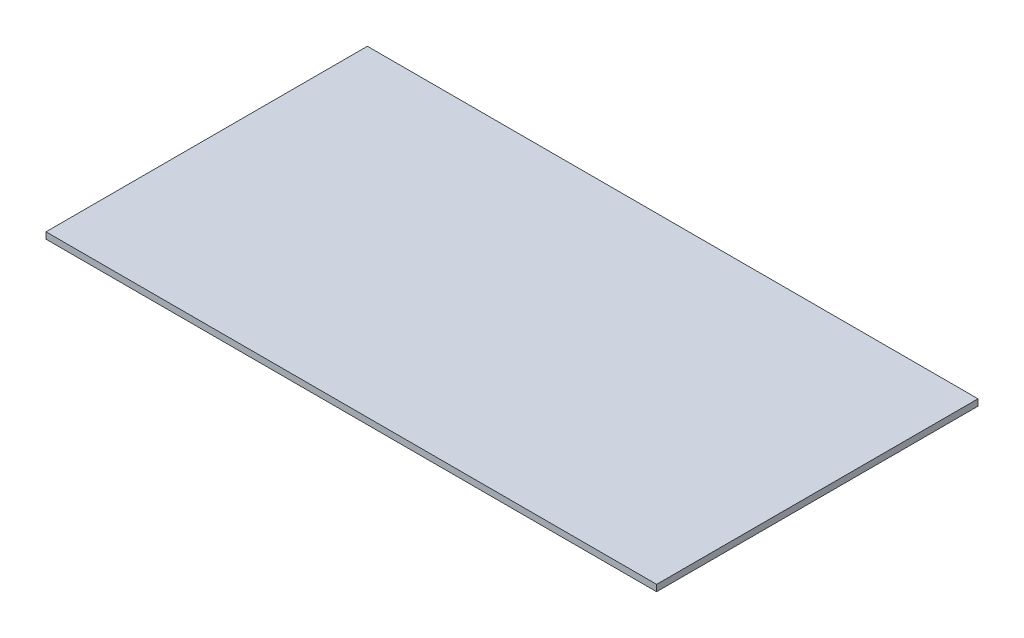
ISO-10303-21;
HEADER;
FILE_DESCRIPTION(('STEP AP214'),'2;1');
FILE_NAME('part.step','',(''),(''),'','','');
FILE_SCHEMA(('AUTOMOTIVE_DESIGN { 1 0 10303 214 1 1 1 1 }'));
ENDSEC;
DATA;
#1=APPLICATION_CONTEXT('core data for automotive mechanical design processes');
#2=APPLICATION_PROTOCOL_DEFINITION('international standard','automotive_design',2000,#1);
#3=PRODUCT_CONTEXT('',#1,'mechanical');
#4=PRODUCT('Part','Part','',(#3));
#5=PRODUCT_RELATED_PRODUCT_CATEGORY('part','',(#4));
#6=PRODUCT_DEFINITION_FORMATION('','',#4);
#7=PRODUCT_DEFINITION_CONTEXT('part definition',#1,'design');
#8=PRODUCT_DEFINITION('design','',#6,#7);
#9=PRODUCT_DEFINITION_SHAPE('','',#8);
#10=(LENGTH_UNIT() NAMED_UNIT(*) SI_UNIT(.MILLI.,.METRE.));
#11=(NAMED_UNIT(*) PLANE_ANGLE_UNIT() SI_UNIT($,.RADIAN.));
#12=(NAMED_UNIT(*) SI_UNIT($,.STERADIAN.) SOLID_ANGLE_UNIT());
#13=UNCERTAINTY_MEASURE_WITH_UNIT(LENGTH_MEASURE(1.E-05),#10,'distance_accuracy_value','');
#14=(GEOMETRIC_REPRESENTATION_CONTEXT(3) GLOBAL_UNCERTAINTY_ASSIGNED_CONTEXT((#13)) GLOBAL_UNIT_ASSIGNED_CONTEXT((#10,
#11,#12)) REPRESENTATION_CONTEXT('',''));
#15=CARTESIAN_POINT('',(0.,0.,0.));
#16=DIRECTION('',(0.,0.,1.));
#17=DIRECTION('',(1.,0.,0.));
#18=AXIS2_PLACEMENT_3D('',#15,#16,#17);
#19=CARTESIAN_POINT('',(0.,2.54,0.));
#20=DIRECTION('',(1.,0.,0.));
#21=DIRECTION('',(0.,0.,-1.));
#22=AXIS2_PLACEMENT_3D('',#19,#20,#21);
#23=PLANE('',#22);
#24=DIRECTION('',(0.,0.,1.));
#25=VECTOR('',#24,1.);
#26=CARTESIAN_POINT('',(0.,0.,0.));
#27=LINE('',#26,#25);
#28=CARTESIAN_POINT('',(0.,0.,-127.));
#29=VERTEX_POINT('',#28);
#30=CARTESIAN_POINT('',(0.,0.,0.));
#31=VERTEX_POINT('',#30);
#32=EDGE_CURVE('E96',#29,#31,#27,.T.);
#33=ORIENTED_EDGE('',*,*,#32,.T.);
#34=DIRECTION('',(0.,-1.,0.));
#35=VECTOR('',#34,1.);
#36=CARTESIAN_POINT('',(0.,2.54,0.));
#37=LINE('',#36,#35);
#38=CARTESIAN_POINT('',(0.,2.54,0.));
#39=VERTEX_POINT('',#38);
#40=EDGE_CURVE('E11',#39,#31,#37,.T.);
#41=ORIENTED_EDGE('',*,*,#40,.F.);
#42=DIRECTION('',(0.,0.,1.));
#43=VECTOR('',#42,1.);
#44=CARTESIAN_POINT('',(0.,2.54,0.));
#45=LINE('',#44,#43);
#46=CARTESIAN_POINT('',(0.,2.54,-127.));
#47=VERTEX_POINT('',#46);
#48=EDGE_CURVE('E84',#47,#39,#45,.T.);
#49=ORIENTED_EDGE('',*,*,#48,.F.);
#50=DIRECTION('',(0.,-1.,0.));
#51=VECTOR('',#50,1.);
#52=CARTESIAN_POINT('',(0.,2.54,-127.));
#53=LINE('',#52,#51);
#54=EDGE_CURVE('E92',#47,#29,#53,.T.);
#55=ORIENTED_EDGE('',*,*,#54,.T.);
#56=EDGE_LOOP('',(#33,#41,#49,#55));
#57=FACE_BOUND('',#56,.T.);
#58=ADVANCED_FACE('F33',(#57),#23,.F.);
#59=CARTESIAN_POINT('',(0.,2.54,0.));
#60=DIRECTION('',(0.,0.,-1.));
#61=DIRECTION('',(-1.,0.,0.));
#62=AXIS2_PLACEMENT_3D('',#59,#60,#61);
#63=PLANE('',#62);
#64=DIRECTION('',(1.,0.,0.));
#65=VECTOR('',#64,1.);
#66=CARTESIAN_POINT('',(0.,0.,0.));
#67=LINE('',#66,#65);
#68=CARTESIAN_POINT('',(241.3,0.,0.));
#69=VERTEX_POINT('',#68);
#70=EDGE_CURVE('E88',#31,#69,#67,.T.);
#71=ORIENTED_EDGE('',*,*,#70,.T.);
#72=DIRECTION('',(0.,-1.,0.));
#73=VECTOR('',#72,1.);
#74=CARTESIAN_POINT('',(241.3,2.54,0.));
#75=LINE('',#74,#73);
#76=CARTESIAN_POINT('',(241.3,2.54,0.));
#77=VERTEX_POINT('',#76);
#78=EDGE_CURVE('E41',#77,#69,#75,.T.);
#79=ORIENTED_EDGE('',*,*,#78,.F.);
#80=DIRECTION('',(1.,0.,0.));
#81=VECTOR('',#80,1.);
#82=CARTESIAN_POINT('',(0.,2.54,0.));
#83=LINE('',#82,#81);
#84=EDGE_CURVE('E79',#39,#77,#83,.T.);
#85=ORIENTED_EDGE('',*,*,#84,.F.);
#86=ORIENTED_EDGE('',*,*,#40,.T.);
#87=EDGE_LOOP('',(#71,#79,#85,#86));
#88=FACE_BOUND('',#87,.T.);
#89=ADVANCED_FACE('F87',(#88),#63,.F.);
#90=CARTESIAN_POINT('',(241.3,2.54,0.));
#91=DIRECTION('',(-1.,0.,0.));
#92=DIRECTION('',(0.,0.,1.));
#93=AXIS2_PLACEMENT_3D('',#90,#91,#92);
#94=PLANE('',#93);
#95=DIRECTION('',(0.,0.,-1.));
#96=VECTOR('',#95,1.);
#97=CARTESIAN_POINT('',(241.3,0.,0.));
#98=LINE('',#97,#96);
#99=CARTESIAN_POINT('',(241.3,0.,-127.));
#100=VERTEX_POINT('',#99);
#101=EDGE_CURVE('E66',#69,#100,#98,.T.);
#102=ORIENTED_EDGE('',*,*,#101,.T.);
#103=DIRECTION('',(0.,-1.,0.));
#104=VECTOR('',#103,1.);
#105=CARTESIAN_POINT('',(241.3,2.54,-127.));
#106=LINE('',#105,#104);
#107=CARTESIAN_POINT('',(241.3,2.54,-127.));
#108=VERTEX_POINT('',#107);
#109=EDGE_CURVE('E89',#108,#100,#106,.T.);
#110=ORIENTED_EDGE('',*,*,#109,.F.);
#111=DIRECTION('',(0.,0.,-1.));
#112=VECTOR('',#111,1.);
#113=CARTESIAN_POINT('',(241.3,2.54,0.));
#114=LINE('',#113,#112);
#115=EDGE_CURVE('E82',#77,#108,#114,.T.);
#116=ORIENTED_EDGE('',*,*,#115,.F.);
#117=ORIENTED_EDGE('',*,*,#78,.T.);
#118=EDGE_LOOP('',(#102,#110,#116,#117));
#119=FACE_BOUND('',#118,.T.);
#120=ADVANCED_FACE('F90',(#119),#94,.F.);
#121=CARTESIAN_POINT('',(0.,2.54,-127.));
#122=DIRECTION('',(0.,0.,1.));
#123=DIRECTION('',(1.,0.,0.));
#124=AXIS2_PLACEMENT_3D('',#121,#122,#123);
#125=PLANE('',#124);
#126=DIRECTION('',(-1.,0.,0.));
#127=VECTOR('',#126,1.);
#128=CARTESIAN_POINT('',(0.,0.,-127.));
#129=LINE('',#128,#127);
#130=EDGE_CURVE('E72',#100,#29,#129,.T.);
#131=ORIENTED_EDGE('',*,*,#130,.T.);
#132=ORIENTED_EDGE('',*,*,#54,.F.);
#133=DIRECTION('',(-1.,0.,0.));
#134=VECTOR('',#133,1.);
#135=CARTESIAN_POINT('',(0.,2.54,-127.));
#136=LINE('',#135,#134);
#137=EDGE_CURVE('E49',#108,#47,#136,.T.);
#138=ORIENTED_EDGE('',*,*,#137,.F.);
#139=ORIENTED_EDGE('',*,*,#109,.T.);
#140=EDGE_LOOP('',(#131,#132,#138,#139));
#141=FACE_BOUND('',#140,.T.);
#142=ADVANCED_FACE('F103',(#141),#125,.F.);
#143=CARTESIAN_POINT('',(0.,2.54,0.));
#144=DIRECTION('',(0.,-1.,0.));
#145=DIRECTION('',(0.,0.,-1.));
#146=AXIS2_PLACEMENT_3D('',#143,#144,#145);
#147=PLANE('',#146);
#148=ORIENTED_EDGE('',*,*,#48,.T.);
#149=ORIENTED_EDGE('',*,*,#84,.T.);
#150=ORIENTED_EDGE('',*,*,#115,.T.);
#151=ORIENTED_EDGE('',*,*,#137,.T.);
#152=EDGE_LOOP('',(#148,#149,#150,#151));
#153=FACE_BOUND('',#152,.T.);
#154=ADVANCED_FACE('F80',(#153),#147,.F.);
#155=CARTESIAN_POINT('',(0.,0.,0.));
#156=DIRECTION('',(0.,-1.,0.));
#157=DIRECTION('',(0.,0.,-1.));
#158=AXIS2_PLACEMENT_3D('',#155,#156,#157);
#159=PLANE('',#158);
#160=ORIENTED_EDGE('',*,*,#32,.F.);
#161=ORIENTED_EDGE('',*,*,#130,.F.);
#162=ORIENTED_EDGE('',*,*,#101,.F.);
#163=ORIENTED_EDGE('',*,*,#70,.F.);
#164=EDGE_LOOP('',(#160,#161,#162,#163));
#165=FACE_BOUND('',#164,.T.);
#166=ADVANCED_FACE('F106',(#165),#159,.T.);
#167=CLOSED_SHELL('',(#58,#89,#120,#142,#154,#166));
#168=MANIFOLD_SOLID_BREP('B2',#167);
#169=ADVANCED_BREP_SHAPE_REPRESENTATION('',(#18,#168),#14);
#170=SHAPE_DEFINITION_REPRESENTATION(#9,#169);
ENDSEC;
END-ISO-10303-21;
